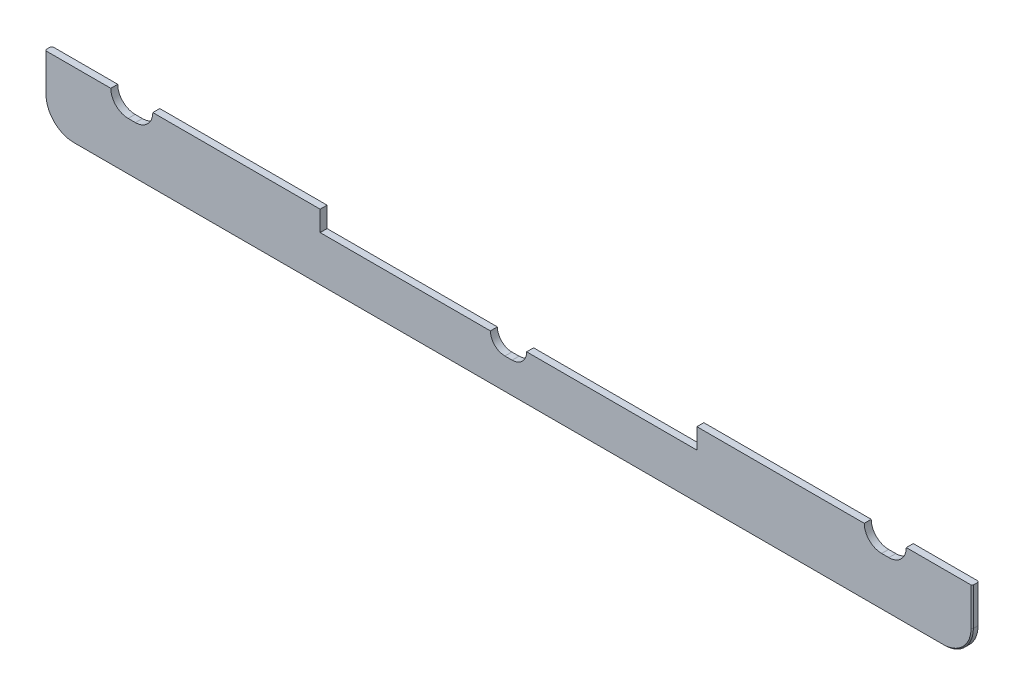
ISO-10303-21;
HEADER;
FILE_DESCRIPTION(('STEP AP214'),'2;1');
FILE_NAME('part.step','',(''),(''),'','','');
FILE_SCHEMA(('AUTOMOTIVE_DESIGN { 1 0 10303 214 1 1 1 1 }'));
ENDSEC;
DATA;
#1=APPLICATION_CONTEXT('core data for automotive mechanical design processes');
#2=APPLICATION_PROTOCOL_DEFINITION('international standard','automotive_design',2000,#1);
#3=PRODUCT_CONTEXT('',#1,'mechanical');
#4=PRODUCT('Part','Part','',(#3));
#5=PRODUCT_RELATED_PRODUCT_CATEGORY('part','',(#4));
#6=PRODUCT_DEFINITION_FORMATION('','',#4);
#7=PRODUCT_DEFINITION_CONTEXT('part definition',#1,'design');
#8=PRODUCT_DEFINITION('design','',#6,#7);
#9=PRODUCT_DEFINITION_SHAPE('','',#8);
#10=(LENGTH_UNIT() NAMED_UNIT(*) SI_UNIT(.MILLI.,.METRE.));
#11=(NAMED_UNIT(*) PLANE_ANGLE_UNIT() SI_UNIT($,.RADIAN.));
#12=(NAMED_UNIT(*) SI_UNIT($,.STERADIAN.) SOLID_ANGLE_UNIT());
#13=UNCERTAINTY_MEASURE_WITH_UNIT(LENGTH_MEASURE(1.E-05),#10,'distance_accuracy_value','');
#14=(GEOMETRIC_REPRESENTATION_CONTEXT(3) GLOBAL_UNCERTAINTY_ASSIGNED_CONTEXT((#13)) GLOBAL_UNIT_ASSIGNED_CONTEXT((#10,
#11,#12)) REPRESENTATION_CONTEXT('',''));
#15=CARTESIAN_POINT('',(0.,0.,0.));
#16=DIRECTION('',(0.,0.,1.));
#17=DIRECTION('',(1.,0.,0.));
#18=AXIS2_PLACEMENT_3D('',#15,#16,#17);
#19=CARTESIAN_POINT('',(-160.,0.,-0.01));
#20=DIRECTION('',(0.,-1.,0.));
#21=DIRECTION('',(0.,0.,-1.));
#22=AXIS2_PLACEMENT_3D('',#19,#20,#21);
#23=PLANE('',#22);
#24=DIRECTION('',(-1.,0.,0.));
#25=VECTOR('',#24,1.);
#26=CARTESIAN_POINT('',(0.,0.,0.));
#27=LINE('',#26,#25);
#28=CARTESIAN_POINT('',(-65.,0.,0.));
#29=VERTEX_POINT('',#28);
#30=CARTESIAN_POINT('',(-122.75,0.,0.));
#31=VERTEX_POINT('',#30);
#32=EDGE_CURVE('E412',#29,#31,#27,.T.);
#33=ORIENTED_EDGE('',*,*,#32,.T.);
#34=DIRECTION('',(0.,0.,-1.));
#35=VECTOR('',#34,1.);
#36=CARTESIAN_POINT('',(-122.75,0.,2.4));
#37=LINE('',#36,#35);
#38=CARTESIAN_POINT('',(-122.75,0.,2.4));
#39=VERTEX_POINT('',#38);
#40=EDGE_CURVE('E437',#31,#39,#37,.F.);
#41=ORIENTED_EDGE('',*,*,#40,.T.);
#42=DIRECTION('',(-1.,0.,0.));
#43=VECTOR('',#42,1.);
#44=CARTESIAN_POINT('',(0.,0.,2.4));
#45=LINE('',#44,#43);
#46=CARTESIAN_POINT('',(-65.,0.,2.4));
#47=VERTEX_POINT('',#46);
#48=EDGE_CURVE('E426',#47,#39,#45,.T.);
#49=ORIENTED_EDGE('',*,*,#48,.F.);
#50=DIRECTION('',(0.,0.,1.));
#51=VECTOR('',#50,1.);
#52=CARTESIAN_POINT('',(-65.,0.,-0.01));
#53=LINE('',#52,#51);
#54=EDGE_CURVE('E388',#29,#47,#53,.T.);
#55=ORIENTED_EDGE('',*,*,#54,.F.);
#56=EDGE_LOOP('',(#33,#41,#49,#55));
#57=FACE_BOUND('',#56,.T.);
#58=ADVANCED_FACE('F41',(#57),#23,.F.);
#59=CARTESIAN_POINT('',(-65.,0.,-0.01));
#60=DIRECTION('',(-1.,0.,0.));
#61=DIRECTION('',(0.,0.,1.));
#62=AXIS2_PLACEMENT_3D('',#59,#60,#61);
#63=PLANE('',#62);
#64=DIRECTION('',(0.,1.,0.));
#65=VECTOR('',#64,1.);
#66=CARTESIAN_POINT('',(-65.,0.,0.));
#67=LINE('',#66,#65);
#68=CARTESIAN_POINT('',(-65.,-7.00000000000001,0.));
#69=VERTEX_POINT('',#68);
#70=EDGE_CURVE('E408',#69,#29,#67,.T.);
#71=ORIENTED_EDGE('',*,*,#70,.T.);
#72=ORIENTED_EDGE('',*,*,#54,.T.);
#73=DIRECTION('',(0.,1.,0.));
#74=VECTOR('',#73,1.);
#75=CARTESIAN_POINT('',(-65.,0.,2.4));
#76=LINE('',#75,#74);
#77=CARTESIAN_POINT('',(-65.,-7.00000000000001,2.4));
#78=VERTEX_POINT('',#77);
#79=EDGE_CURVE('E423',#78,#47,#76,.T.);
#80=ORIENTED_EDGE('',*,*,#79,.F.);
#81=DIRECTION('',(0.,0.,1.));
#82=VECTOR('',#81,1.);
#83=CARTESIAN_POINT('',(-65.,-7.00000000000001,-0.01));
#84=LINE('',#83,#82);
#85=EDGE_CURVE('E431',#69,#78,#84,.T.);
#86=ORIENTED_EDGE('',*,*,#85,.F.);
#87=EDGE_LOOP('',(#71,#72,#80,#86));
#88=FACE_BOUND('',#87,.T.);
#89=ADVANCED_FACE('F559',(#88),#63,.F.);
#90=CARTESIAN_POINT('',(-65.,-7.00000000000001,-0.01));
#91=DIRECTION('',(0.,-1.,0.));
#92=DIRECTION('',(1.,0.,0.));
#93=AXIS2_PLACEMENT_3D('',#90,#91,#92);
#94=PLANE('',#93);
#95=DIRECTION('',(-1.,0.,0.));
#96=VECTOR('',#95,1.);
#97=CARTESIAN_POINT('',(0.,-7.,0.));
#98=LINE('',#97,#96);
#99=CARTESIAN_POINT('',(-6.25,-7.,0.));
#100=VERTEX_POINT('',#99);
#101=EDGE_CURVE('E411',#100,#69,#98,.T.);
#102=ORIENTED_EDGE('',*,*,#101,.T.);
#103=ORIENTED_EDGE('',*,*,#85,.T.);
#104=DIRECTION('',(-1.,0.,0.));
#105=VECTOR('',#104,1.);
#106=CARTESIAN_POINT('',(0.,-7.,2.4));
#107=LINE('',#106,#105);
#108=CARTESIAN_POINT('',(-6.25,-7.,2.4));
#109=VERTEX_POINT('',#108);
#110=EDGE_CURVE('E421',#109,#78,#107,.T.);
#111=ORIENTED_EDGE('',*,*,#110,.F.);
#112=DIRECTION('',(0.,0.,-1.));
#113=VECTOR('',#112,1.);
#114=CARTESIAN_POINT('',(-6.25,-7.,2.4));
#115=LINE('',#114,#113);
#116=EDGE_CURVE('E235',#109,#100,#115,.T.);
#117=ORIENTED_EDGE('',*,*,#116,.T.);
#118=EDGE_LOOP('',(#102,#103,#111,#117));
#119=FACE_BOUND('',#118,.T.);
#120=ADVANCED_FACE('F569',(#119),#94,.F.);
#121=CARTESIAN_POINT('',(65.,-6.99999999999999,-0.01));
#122=DIRECTION('',(1.,0.,0.));
#123=DIRECTION('',(0.,0.,-1.));
#124=AXIS2_PLACEMENT_3D('',#121,#122,#123);
#125=PLANE('',#124);
#126=DIRECTION('',(0.,-1.,0.));
#127=VECTOR('',#126,1.);
#128=CARTESIAN_POINT('',(65.,0.,0.));
#129=LINE('',#128,#127);
#130=CARTESIAN_POINT('',(65.,0.,0.));
#131=VERTEX_POINT('',#130);
#132=CARTESIAN_POINT('',(65.,-6.99999999999999,0.));
#133=VERTEX_POINT('',#132);
#134=EDGE_CURVE('E405',#131,#133,#129,.T.);
#135=ORIENTED_EDGE('',*,*,#134,.T.);
#136=DIRECTION('',(0.,0.,1.));
#137=VECTOR('',#136,1.);
#138=CARTESIAN_POINT('',(65.,-6.99999999999999,-0.01));
#139=LINE('',#138,#137);
#140=CARTESIAN_POINT('',(65.,-6.99999999999999,2.4));
#141=VERTEX_POINT('',#140);
#142=EDGE_CURVE('E50',#133,#141,#139,.T.);
#143=ORIENTED_EDGE('',*,*,#142,.T.);
#144=DIRECTION('',(0.,-1.,0.));
#145=VECTOR('',#144,1.);
#146=CARTESIAN_POINT('',(65.,0.,2.4));
#147=LINE('',#146,#145);
#148=CARTESIAN_POINT('',(65.,0.,2.4));
#149=VERTEX_POINT('',#148);
#150=EDGE_CURVE('E416',#149,#141,#147,.T.);
#151=ORIENTED_EDGE('',*,*,#150,.F.);
#152=DIRECTION('',(0.,0.,1.));
#153=VECTOR('',#152,1.);
#154=CARTESIAN_POINT('',(65.,0.,-0.01));
#155=LINE('',#154,#153);
#156=EDGE_CURVE('E11',#131,#149,#155,.T.);
#157=ORIENTED_EDGE('',*,*,#156,.F.);
#158=EDGE_LOOP('',(#135,#143,#151,#157));
#159=FACE_BOUND('',#158,.T.);
#160=ADVANCED_FACE('F568',(#159),#125,.F.);
#161=CARTESIAN_POINT('',(65.,0.,-0.01));
#162=DIRECTION('',(0.,-1.,0.));
#163=DIRECTION('',(1.,0.,0.));
#164=AXIS2_PLACEMENT_3D('',#161,#162,#163);
#165=PLANE('',#164);
#166=DIRECTION('',(-1.,0.,0.));
#167=VECTOR('',#166,1.);
#168=CARTESIAN_POINT('',(0.,0.,0.));
#169=LINE('',#168,#167);
#170=CARTESIAN_POINT('',(122.75,0.,0.));
#171=VERTEX_POINT('',#170);
#172=EDGE_CURVE('E45',#171,#131,#169,.T.);
#173=ORIENTED_EDGE('',*,*,#172,.T.);
#174=ORIENTED_EDGE('',*,*,#156,.T.);
#175=DIRECTION('',(-1.,0.,0.));
#176=VECTOR('',#175,1.);
#177=CARTESIAN_POINT('',(0.,0.,2.4));
#178=LINE('',#177,#176);
#179=CARTESIAN_POINT('',(122.75,0.,2.4));
#180=VERTEX_POINT('',#179);
#181=EDGE_CURVE('E418',#180,#149,#178,.T.);
#182=ORIENTED_EDGE('',*,*,#181,.F.);
#183=DIRECTION('',(0.,0.,-1.));
#184=VECTOR('',#183,1.);
#185=CARTESIAN_POINT('',(122.75,0.,2.4));
#186=LINE('',#185,#184);
#187=EDGE_CURVE('E398',#180,#171,#186,.T.);
#188=ORIENTED_EDGE('',*,*,#187,.T.);
#189=EDGE_LOOP('',(#173,#174,#182,#188));
#190=FACE_BOUND('',#189,.T.);
#191=ADVANCED_FACE('F459',(#190),#165,.F.);
#192=DIRECTION('',(-1.,0.,0.));
#193=VECTOR('',#192,1.);
#194=CARTESIAN_POINT('',(0.,-7.,0.));
#195=LINE('',#194,#193);
#196=CARTESIAN_POINT('',(6.25,-7.,0.));
#197=VERTEX_POINT('',#196);
#198=EDGE_CURVE('E407',#133,#197,#195,.T.);
#199=ORIENTED_EDGE('',*,*,#198,.T.);
#200=DIRECTION('',(0.,0.,-1.));
#201=VECTOR('',#200,1.);
#202=CARTESIAN_POINT('',(6.25,-7.,2.4));
#203=LINE('',#202,#201);
#204=CARTESIAN_POINT('',(6.25,-7.,2.4));
#205=VERTEX_POINT('',#204);
#206=EDGE_CURVE('E393',#197,#205,#203,.F.);
#207=ORIENTED_EDGE('',*,*,#206,.T.);
#208=DIRECTION('',(-1.,0.,0.));
#209=VECTOR('',#208,1.);
#210=CARTESIAN_POINT('',(0.,-7.,2.4));
#211=LINE('',#210,#209);
#212=EDGE_CURVE('E414',#141,#205,#211,.T.);
#213=ORIENTED_EDGE('',*,*,#212,.F.);
#214=ORIENTED_EDGE('',*,*,#142,.F.);
#215=EDGE_LOOP('',(#199,#207,#213,#214));
#216=FACE_BOUND('',#215,.T.);
#217=ADVANCED_FACE('F566',(#216),#94,.F.);
#218=DIRECTION('',(-0.707106781186583,0.,-0.707106781186512));
#219=VECTOR('',#218,1.);
#220=CARTESIAN_POINT('',(-159.6,0.,2.4));
#221=LINE('',#220,#219);
#222=CARTESIAN_POINT('',(-160.,0.,2.00000000000007));
#223=VERTEX_POINT('',#222);
#224=CARTESIAN_POINT('',(-159.6,0.,2.4));
#225=VERTEX_POINT('',#224);
#226=EDGE_CURVE('E396',#223,#225,#221,.F.);
#227=ORIENTED_EDGE('',*,*,#226,.T.);
#228=CARTESIAN_POINT('',(-137.25,0.,2.4));
#229=VERTEX_POINT('',#228);
#230=EDGE_CURVE('E427',#229,#225,#45,.T.);
#231=ORIENTED_EDGE('',*,*,#230,.F.);
#232=DIRECTION('',(0.,0.,-1.));
#233=VECTOR('',#232,1.);
#234=CARTESIAN_POINT('',(-137.25,0.,2.4));
#235=LINE('',#234,#233);
#236=CARTESIAN_POINT('',(-137.25,0.,0.));
#237=VERTEX_POINT('',#236);
#238=EDGE_CURVE('E440',#229,#237,#235,.T.);
#239=ORIENTED_EDGE('',*,*,#238,.T.);
#240=CARTESIAN_POINT('',(-159.6,0.,0.));
#241=VERTEX_POINT('',#240);
#242=EDGE_CURVE('E445',#237,#241,#27,.T.);
#243=ORIENTED_EDGE('',*,*,#242,.T.);
#244=DIRECTION('',(-0.707106781186534,0.,0.707106781186561));
#245=VECTOR('',#244,1.);
#246=CARTESIAN_POINT('',(-160.,0.,0.400000000000033));
#247=LINE('',#246,#245);
#248=CARTESIAN_POINT('',(-160.,0.,0.400000000000039));
#249=VERTEX_POINT('',#248);
#250=EDGE_CURVE('E389',#241,#249,#247,.T.);
#251=ORIENTED_EDGE('',*,*,#250,.T.);
#252=DIRECTION('',(0.,0.,-1.));
#253=VECTOR('',#252,1.);
#254=CARTESIAN_POINT('',(-160.,0.,2.4));
#255=LINE('',#254,#253);
#256=EDGE_CURVE('E402',#223,#249,#255,.T.);
#257=ORIENTED_EDGE('',*,*,#256,.F.);
#258=EDGE_LOOP('',(#227,#231,#239,#243,#251,#257));
#259=FACE_BOUND('',#258,.T.);
#260=ADVANCED_FACE('F43',(#259),#23,.F.);
#261=DIRECTION('',(-0.707106781186561,0.,0.707106781186534));
#262=VECTOR('',#261,1.);
#263=CARTESIAN_POINT('',(159.6,0.,2.4));
#264=LINE('',#263,#262);
#265=CARTESIAN_POINT('',(159.6,0.,2.4));
#266=VERTEX_POINT('',#265);
#267=CARTESIAN_POINT('',(160.,0.,2.00000000000007));
#268=VERTEX_POINT('',#267);
#269=EDGE_CURVE('E392',#266,#268,#264,.F.);
#270=ORIENTED_EDGE('',*,*,#269,.T.);
#271=DIRECTION('',(0.,0.,1.));
#272=VECTOR('',#271,1.);
#273=CARTESIAN_POINT('',(160.,0.,2.4));
#274=LINE('',#273,#272);
#275=CARTESIAN_POINT('',(160.,0.,0.400000000000039));
#276=VERTEX_POINT('',#275);
#277=EDGE_CURVE('E363',#276,#268,#274,.T.);
#278=ORIENTED_EDGE('',*,*,#277,.F.);
#279=DIRECTION('',(-0.707106781186512,0.,-0.707106781186583));
#280=VECTOR('',#279,1.);
#281=CARTESIAN_POINT('',(160.,0.,0.400000000000043));
#282=LINE('',#281,#280);
#283=CARTESIAN_POINT('',(159.6,0.,0.));
#284=VERTEX_POINT('',#283);
#285=EDGE_CURVE('E65',#276,#284,#282,.T.);
#286=ORIENTED_EDGE('',*,*,#285,.T.);
#287=DIRECTION('',(-1.,0.,0.));
#288=VECTOR('',#287,1.);
#289=CARTESIAN_POINT('',(0.,0.,0.));
#290=LINE('',#289,#288);
#291=CARTESIAN_POINT('',(137.25,0.,0.));
#292=VERTEX_POINT('',#291);
#293=EDGE_CURVE('E58',#284,#292,#290,.T.);
#294=ORIENTED_EDGE('',*,*,#293,.T.);
#295=DIRECTION('',(0.,0.,-1.));
#296=VECTOR('',#295,1.);
#297=CARTESIAN_POINT('',(137.25,0.,2.4));
#298=LINE('',#297,#296);
#299=CARTESIAN_POINT('',(137.25,0.,2.4));
#300=VERTEX_POINT('',#299);
#301=EDGE_CURVE('E400',#292,#300,#298,.F.);
#302=ORIENTED_EDGE('',*,*,#301,.T.);
#303=DIRECTION('',(-1.,0.,0.));
#304=VECTOR('',#303,1.);
#305=CARTESIAN_POINT('',(0.,0.,2.4));
#306=LINE('',#305,#304);
#307=EDGE_CURVE('E404',#266,#300,#306,.T.);
#308=ORIENTED_EDGE('',*,*,#307,.F.);
#309=EDGE_LOOP('',(#270,#278,#286,#294,#302,#308));
#310=FACE_BOUND('',#309,.T.);
#311=ADVANCED_FACE('F478',(#310),#165,.F.);
#312=CARTESIAN_POINT('',(0.,0.,2.4));
#313=DIRECTION('',(0.,0.,-1.));
#314=DIRECTION('',(-1.,0.,0.));
#315=AXIS2_PLACEMENT_3D('',#312,#313,#314);
#316=PLANE('',#315);
#317=CARTESIAN_POINT('',(-131.25,0.,2.4));
#318=DIRECTION('',(0.,0.,1.));
#319=DIRECTION('',(1.,0.,0.));
#320=AXIS2_PLACEMENT_3D('',#317,#318,#319);
#321=CIRCLE('',#320,6.00000000000005);
#322=CARTESIAN_POINT('',(-131.25,-6.00000000000005,2.4));
#323=VERTEX_POINT('',#322);
#324=EDGE_CURVE('E290',#229,#323,#321,.T.);
#325=ORIENTED_EDGE('',*,*,#324,.F.);
#326=ORIENTED_EDGE('',*,*,#230,.T.);
#327=DIRECTION('',(0.,-1.,0.));
#328=VECTOR('',#327,1.);
#329=CARTESIAN_POINT('',(-159.6,0.,2.4));
#330=LINE('',#329,#328);
#331=CARTESIAN_POINT('',(-159.6,-13.,2.4));
#332=VERTEX_POINT('',#331);
#333=EDGE_CURVE('E319',#225,#332,#330,.T.);
#334=ORIENTED_EDGE('',*,*,#333,.T.);
#335=CARTESIAN_POINT('',(-150.,-13.,2.4));
#336=DIRECTION('',(0.,0.,-1.));
#337=DIRECTION('',(-1.,0.,0.));
#338=AXIS2_PLACEMENT_3D('',#335,#336,#337);
#339=CIRCLE('',#338,9.60000000000004);
#340=CARTESIAN_POINT('',(-150.,-22.6,2.4));
#341=VERTEX_POINT('',#340);
#342=EDGE_CURVE('E321',#332,#341,#339,.F.);
#343=ORIENTED_EDGE('',*,*,#342,.T.);
#344=DIRECTION('',(1.,0.,0.));
#345=VECTOR('',#344,1.);
#346=CARTESIAN_POINT('',(0.,-22.6000000000001,2.4));
#347=LINE('',#346,#345);
#348=CARTESIAN_POINT('',(150.,-22.6000000000001,2.4));
#349=VERTEX_POINT('',#348);
#350=EDGE_CURVE('E323',#341,#349,#347,.T.);
#351=ORIENTED_EDGE('',*,*,#350,.T.);
#352=CARTESIAN_POINT('',(150.,-13.,2.4));
#353=DIRECTION('',(0.,0.,-1.));
#354=DIRECTION('',(-1.,0.,0.));
#355=AXIS2_PLACEMENT_3D('',#352,#353,#354);
#356=CIRCLE('',#355,9.60000000000005);
#357=CARTESIAN_POINT('',(159.6,-13.,2.4));
#358=VERTEX_POINT('',#357);
#359=EDGE_CURVE('E325',#349,#358,#356,.F.);
#360=ORIENTED_EDGE('',*,*,#359,.T.);
#361=DIRECTION('',(0.,1.,0.));
#362=VECTOR('',#361,1.);
#363=CARTESIAN_POINT('',(159.6,0.,2.4));
#364=LINE('',#363,#362);
#365=EDGE_CURVE('E327',#358,#266,#364,.T.);
#366=ORIENTED_EDGE('',*,*,#365,.T.);
#367=ORIENTED_EDGE('',*,*,#307,.T.);
#368=CARTESIAN_POINT('',(131.25,0.,2.4));
#369=DIRECTION('',(0.,0.,1.));
#370=DIRECTION('',(1.,0.,0.));
#371=AXIS2_PLACEMENT_3D('',#368,#369,#370);
#372=CIRCLE('',#371,6.00000000000001);
#373=CARTESIAN_POINT('',(131.25,-5.99999999999999,2.4));
#374=VERTEX_POINT('',#373);
#375=EDGE_CURVE('E267',#374,#300,#372,.T.);
#376=ORIENTED_EDGE('',*,*,#375,.F.);
#377=DIRECTION('',(1.,0.,0.));
#378=VECTOR('',#377,1.);
#379=CARTESIAN_POINT('',(131.25,-5.99999999999999,2.4));
#380=LINE('',#379,#378);
#381=CARTESIAN_POINT('',(128.75,-5.99999999999999,2.4));
#382=VERTEX_POINT('',#381);
#383=EDGE_CURVE('E273',#382,#374,#380,.T.);
#384=ORIENTED_EDGE('',*,*,#383,.F.);
#385=CARTESIAN_POINT('',(128.75,0.,2.4));
#386=DIRECTION('',(0.,0.,1.));
#387=DIRECTION('',(1.,0.,0.));
#388=AXIS2_PLACEMENT_3D('',#385,#386,#387);
#389=CIRCLE('',#388,6.00000000000001);
#390=EDGE_CURVE('E270',#180,#382,#389,.T.);
#391=ORIENTED_EDGE('',*,*,#390,.F.);
#392=ORIENTED_EDGE('',*,*,#181,.T.);
#393=ORIENTED_EDGE('',*,*,#150,.T.);
#394=ORIENTED_EDGE('',*,*,#212,.T.);
#395=CARTESIAN_POINT('',(1.25,-7.,2.4));
#396=DIRECTION('',(0.,0.,1.));
#397=DIRECTION('',(1.,0.,0.));
#398=AXIS2_PLACEMENT_3D('',#395,#396,#397);
#399=CIRCLE('',#398,5.);
#400=CARTESIAN_POINT('',(1.25,-12.,2.4));
#401=VERTEX_POINT('',#400);
#402=EDGE_CURVE('E256',#401,#205,#399,.T.);
#403=ORIENTED_EDGE('',*,*,#402,.F.);
#404=DIRECTION('',(1.,0.,0.));
#405=VECTOR('',#404,1.);
#406=CARTESIAN_POINT('',(-1.25,-12.,2.4));
#407=LINE('',#406,#405);
#408=CARTESIAN_POINT('',(-1.25,-12.,2.4));
#409=VERTEX_POINT('',#408);
#410=EDGE_CURVE('E240',#409,#401,#407,.T.);
#411=ORIENTED_EDGE('',*,*,#410,.F.);
#412=CARTESIAN_POINT('',(-1.25,-7.,2.4));
#413=DIRECTION('',(0.,0.,1.));
#414=DIRECTION('',(1.,0.,0.));
#415=AXIS2_PLACEMENT_3D('',#412,#413,#414);
#416=CIRCLE('',#415,5.);
#417=EDGE_CURVE('E230',#109,#409,#416,.T.);
#418=ORIENTED_EDGE('',*,*,#417,.F.);
#419=ORIENTED_EDGE('',*,*,#110,.T.);
#420=ORIENTED_EDGE('',*,*,#79,.T.);
#421=ORIENTED_EDGE('',*,*,#48,.T.);
#422=CARTESIAN_POINT('',(-128.75,0.,2.4));
#423=DIRECTION('',(0.,0.,1.));
#424=DIRECTION('',(1.,0.,0.));
#425=AXIS2_PLACEMENT_3D('',#422,#423,#424);
#426=CIRCLE('',#425,6.00000000000005);
#427=CARTESIAN_POINT('',(-128.75,-6.00000000000005,2.4));
#428=VERTEX_POINT('',#427);
#429=EDGE_CURVE('E287',#428,#39,#426,.T.);
#430=ORIENTED_EDGE('',*,*,#429,.F.);
#431=DIRECTION('',(1.,0.,0.));
#432=VECTOR('',#431,1.);
#433=CARTESIAN_POINT('',(-128.75,-6.00000000000005,2.4));
#434=LINE('',#433,#432);
#435=EDGE_CURVE('E293',#323,#428,#434,.T.);
#436=ORIENTED_EDGE('',*,*,#435,.F.);
#437=EDGE_LOOP('',(#325,#326,#334,#343,#351,#360,#366,#367,#376,#384,#391,#392,#393,#394,#403,
#411,#418,#419,#420,#421,#430,#436));
#438=FACE_BOUND('',#437,.T.);
#439=ADVANCED_FACE('F254',(#438),#316,.F.);
#440=CARTESIAN_POINT('',(0.,0.,0.));
#441=DIRECTION('',(0.,0.,-1.));
#442=DIRECTION('',(-1.,0.,0.));
#443=AXIS2_PLACEMENT_3D('',#440,#441,#442);
#444=PLANE('',#443);
#445=ORIENTED_EDGE('',*,*,#242,.F.);
#446=CARTESIAN_POINT('',(-131.25,0.,0.));
#447=DIRECTION('',(0.,0.,1.));
#448=DIRECTION('',(1.,0.,0.));
#449=AXIS2_PLACEMENT_3D('',#446,#447,#448);
#450=CIRCLE('',#449,6.00000000000005);
#451=CARTESIAN_POINT('',(-131.25,-6.00000000000005,0.));
#452=VERTEX_POINT('',#451);
#453=EDGE_CURVE('E298',#237,#452,#450,.T.);
#454=ORIENTED_EDGE('',*,*,#453,.T.);
#455=DIRECTION('',(1.,0.,0.));
#456=VECTOR('',#455,1.);
#457=CARTESIAN_POINT('',(-128.75,-6.00000000000005,0.));
#458=LINE('',#457,#456);
#459=CARTESIAN_POINT('',(-128.75,-6.00000000000005,0.));
#460=VERTEX_POINT('',#459);
#461=EDGE_CURVE('E291',#452,#460,#458,.T.);
#462=ORIENTED_EDGE('',*,*,#461,.T.);
#463=CARTESIAN_POINT('',(-128.75,0.,0.));
#464=DIRECTION('',(0.,0.,1.));
#465=DIRECTION('',(1.,0.,0.));
#466=AXIS2_PLACEMENT_3D('',#463,#464,#465);
#467=CIRCLE('',#466,6.00000000000005);
#468=EDGE_CURVE('E286',#460,#31,#467,.T.);
#469=ORIENTED_EDGE('',*,*,#468,.T.);
#470=ORIENTED_EDGE('',*,*,#32,.F.);
#471=ORIENTED_EDGE('',*,*,#70,.F.);
#472=ORIENTED_EDGE('',*,*,#101,.F.);
#473=CARTESIAN_POINT('',(-1.25,-7.,0.));
#474=DIRECTION('',(0.,0.,1.));
#475=DIRECTION('',(1.,0.,0.));
#476=AXIS2_PLACEMENT_3D('',#473,#474,#475);
#477=CIRCLE('',#476,5.);
#478=CARTESIAN_POINT('',(-1.25,-12.,0.));
#479=VERTEX_POINT('',#478);
#480=EDGE_CURVE('E260',#100,#479,#477,.T.);
#481=ORIENTED_EDGE('',*,*,#480,.T.);
#482=DIRECTION('',(1.,0.,0.));
#483=VECTOR('',#482,1.);
#484=CARTESIAN_POINT('',(-1.25,-12.,0.));
#485=LINE('',#484,#483);
#486=CARTESIAN_POINT('',(1.25,-12.,0.));
#487=VERTEX_POINT('',#486);
#488=EDGE_CURVE('E248',#479,#487,#485,.T.);
#489=ORIENTED_EDGE('',*,*,#488,.T.);
#490=CARTESIAN_POINT('',(1.25,-7.,0.));
#491=DIRECTION('',(0.,0.,1.));
#492=DIRECTION('',(1.,0.,0.));
#493=AXIS2_PLACEMENT_3D('',#490,#491,#492);
#494=CIRCLE('',#493,5.);
#495=EDGE_CURVE('E241',#487,#197,#494,.T.);
#496=ORIENTED_EDGE('',*,*,#495,.T.);
#497=ORIENTED_EDGE('',*,*,#198,.F.);
#498=ORIENTED_EDGE('',*,*,#134,.F.);
#499=ORIENTED_EDGE('',*,*,#172,.F.);
#500=CARTESIAN_POINT('',(128.75,0.,0.));
#501=DIRECTION('',(0.,0.,1.));
#502=DIRECTION('',(1.,0.,0.));
#503=AXIS2_PLACEMENT_3D('',#500,#501,#502);
#504=CIRCLE('',#503,6.00000000000001);
#505=CARTESIAN_POINT('',(128.75,-5.99999999999999,0.));
#506=VERTEX_POINT('',#505);
#507=EDGE_CURVE('E277',#171,#506,#504,.T.);
#508=ORIENTED_EDGE('',*,*,#507,.T.);
#509=DIRECTION('',(1.,0.,0.));
#510=VECTOR('',#509,1.);
#511=CARTESIAN_POINT('',(131.25,-5.99999999999999,0.));
#512=LINE('',#511,#510);
#513=CARTESIAN_POINT('',(131.25,-5.99999999999999,0.));
#514=VERTEX_POINT('',#513);
#515=EDGE_CURVE('E271',#506,#514,#512,.T.);
#516=ORIENTED_EDGE('',*,*,#515,.T.);
#517=CARTESIAN_POINT('',(131.25,0.,0.));
#518=DIRECTION('',(0.,0.,1.));
#519=DIRECTION('',(1.,0.,0.));
#520=AXIS2_PLACEMENT_3D('',#517,#518,#519);
#521=CIRCLE('',#520,6.00000000000001);
#522=EDGE_CURVE('E249',#514,#292,#521,.T.);
#523=ORIENTED_EDGE('',*,*,#522,.T.);
#524=ORIENTED_EDGE('',*,*,#293,.F.);
#525=DIRECTION('',(0.,-1.,0.));
#526=VECTOR('',#525,1.);
#527=CARTESIAN_POINT('',(159.6,-13.,0.));
#528=LINE('',#527,#526);
#529=CARTESIAN_POINT('',(159.6,-13.,0.));
#530=VERTEX_POINT('',#529);
#531=EDGE_CURVE('E361',#284,#530,#528,.T.);
#532=ORIENTED_EDGE('',*,*,#531,.T.);
#533=CARTESIAN_POINT('',(150.,-13.,0.));
#534=DIRECTION('',(0.,0.,-1.));
#535=DIRECTION('',(-1.,0.,0.));
#536=AXIS2_PLACEMENT_3D('',#533,#534,#535);
#537=CIRCLE('',#536,9.6);
#538=CARTESIAN_POINT('',(150.,-22.6,0.));
#539=VERTEX_POINT('',#538);
#540=EDGE_CURVE('E359',#530,#539,#537,.T.);
#541=ORIENTED_EDGE('',*,*,#540,.T.);
#542=DIRECTION('',(-1.,0.,0.));
#543=VECTOR('',#542,1.);
#544=CARTESIAN_POINT('',(-150.,-22.6,0.));
#545=LINE('',#544,#543);
#546=CARTESIAN_POINT('',(-150.,-22.6,0.));
#547=VERTEX_POINT('',#546);
#548=EDGE_CURVE('E357',#539,#547,#545,.T.);
#549=ORIENTED_EDGE('',*,*,#548,.T.);
#550=CARTESIAN_POINT('',(-150.,-13.,0.));
#551=DIRECTION('',(0.,0.,-1.));
#552=DIRECTION('',(-1.,0.,0.));
#553=AXIS2_PLACEMENT_3D('',#550,#551,#552);
#554=CIRCLE('',#553,9.6);
#555=CARTESIAN_POINT('',(-159.6,-13.,0.));
#556=VERTEX_POINT('',#555);
#557=EDGE_CURVE('E355',#547,#556,#554,.T.);
#558=ORIENTED_EDGE('',*,*,#557,.T.);
#559=DIRECTION('',(0.,1.,0.));
#560=VECTOR('',#559,1.);
#561=CARTESIAN_POINT('',(-159.6,17.,0.));
#562=LINE('',#561,#560);
#563=EDGE_CURVE('E352',#556,#241,#562,.T.);
#564=ORIENTED_EDGE('',*,*,#563,.T.);
#565=EDGE_LOOP('',(#445,#454,#462,#469,#470,#471,#472,#481,#489,#496,#497,#498,#499,#508,#516,
#523,#524,#532,#541,#549,#558,#564));
#566=FACE_BOUND('',#565,.T.);
#567=ADVANCED_FACE('F463',(#566),#444,.T.);
#568=CARTESIAN_POINT('',(-160.,-23.,2.4));
#569=DIRECTION('',(1.,0.,0.));
#570=DIRECTION('',(0.,1.,0.));
#571=AXIS2_PLACEMENT_3D('',#568,#569,#570);
#572=PLANE('',#571);
#573=DIRECTION('',(0.,1.,0.));
#574=VECTOR('',#573,1.);
#575=CARTESIAN_POINT('',(-160.,-23.,2.00000000000007));
#576=LINE('',#575,#574);
#577=CARTESIAN_POINT('',(-160.,-13.,2.00000000000007));
#578=VERTEX_POINT('',#577);
#579=EDGE_CURVE('E349',#578,#223,#576,.T.);
#580=ORIENTED_EDGE('',*,*,#579,.T.);
#581=ORIENTED_EDGE('',*,*,#256,.T.);
#582=DIRECTION('',(0.,-1.,0.));
#583=VECTOR('',#582,1.);
#584=CARTESIAN_POINT('',(-160.,-13.,0.400000000000039));
#585=LINE('',#584,#583);
#586=CARTESIAN_POINT('',(-160.,-13.,0.400000000000039));
#587=VERTEX_POINT('',#586);
#588=EDGE_CURVE('E347',#249,#587,#585,.T.);
#589=ORIENTED_EDGE('',*,*,#588,.T.);
#590=DIRECTION('',(0.,0.,-1.));
#591=VECTOR('',#590,1.);
#592=CARTESIAN_POINT('',(-160.,-13.,2.4));
#593=LINE('',#592,#591);
#594=EDGE_CURVE('E310',#587,#578,#593,.F.);
#595=ORIENTED_EDGE('',*,*,#594,.T.);
#596=EDGE_LOOP('',(#580,#581,#589,#595));
#597=FACE_BOUND('',#596,.T.);
#598=ADVANCED_FACE('F528',(#597),#572,.F.);
#599=CARTESIAN_POINT('',(160.,-23.,2.4));
#600=DIRECTION('',(0.,1.,0.));
#601=DIRECTION('',(-1.,0.,0.));
#602=AXIS2_PLACEMENT_3D('',#599,#600,#601);
#603=PLANE('',#602);
#604=DIRECTION('',(0.,0.,-1.));
#605=VECTOR('',#604,1.);
#606=CARTESIAN_POINT('',(150.,-23.,2.4));
#607=LINE('',#606,#605);
#608=CARTESIAN_POINT('',(150.,-23.,0.400000000000039));
#609=VERTEX_POINT('',#608);
#610=CARTESIAN_POINT('',(150.,-23.,2.00000000000007));
#611=VERTEX_POINT('',#610);
#612=EDGE_CURVE('E313',#609,#611,#607,.F.);
#613=ORIENTED_EDGE('',*,*,#612,.T.);
#614=DIRECTION('',(-1.,0.,0.));
#615=VECTOR('',#614,1.);
#616=CARTESIAN_POINT('',(160.,-23.,2.00000000000007));
#617=LINE('',#616,#615);
#618=CARTESIAN_POINT('',(-150.,-23.,2.00000000000007));
#619=VERTEX_POINT('',#618);
#620=EDGE_CURVE('E341',#611,#619,#617,.T.);
#621=ORIENTED_EDGE('',*,*,#620,.T.);
#622=DIRECTION('',(0.,0.,-1.));
#623=VECTOR('',#622,1.);
#624=CARTESIAN_POINT('',(-150.,-23.,2.4));
#625=LINE('',#624,#623);
#626=CARTESIAN_POINT('',(-150.,-23.,0.400000000000039));
#627=VERTEX_POINT('',#626);
#628=EDGE_CURVE('E316',#619,#627,#625,.T.);
#629=ORIENTED_EDGE('',*,*,#628,.T.);
#630=DIRECTION('',(1.,0.,0.));
#631=VECTOR('',#630,1.);
#632=CARTESIAN_POINT('',(150.,-23.,0.400000000000039));
#633=LINE('',#632,#631);
#634=EDGE_CURVE('E339',#627,#609,#633,.T.);
#635=ORIENTED_EDGE('',*,*,#634,.T.);
#636=EDGE_LOOP('',(#613,#621,#629,#635));
#637=FACE_BOUND('',#636,.T.);
#638=ADVANCED_FACE('F511',(#637),#603,.F.);
#639=CARTESIAN_POINT('',(160.,-23.,2.4));
#640=DIRECTION('',(-1.,0.,0.));
#641=DIRECTION('',(0.,-1.,0.));
#642=AXIS2_PLACEMENT_3D('',#639,#640,#641);
#643=PLANE('',#642);
#644=DIRECTION('',(0.,1.,0.));
#645=VECTOR('',#644,1.);
#646=CARTESIAN_POINT('',(160.,17.,0.400000000000039));
#647=LINE('',#646,#645);
#648=CARTESIAN_POINT('',(160.,-13.,0.400000000000039));
#649=VERTEX_POINT('',#648);
#650=EDGE_CURVE('E330',#649,#276,#647,.T.);
#651=ORIENTED_EDGE('',*,*,#650,.T.);
#652=ORIENTED_EDGE('',*,*,#277,.T.);
#653=DIRECTION('',(0.,-1.,0.));
#654=VECTOR('',#653,1.);
#655=CARTESIAN_POINT('',(160.,-23.,2.00000000000007));
#656=LINE('',#655,#654);
#657=CARTESIAN_POINT('',(160.,-13.,2.00000000000007));
#658=VERTEX_POINT('',#657);
#659=EDGE_CURVE('E333',#268,#658,#656,.T.);
#660=ORIENTED_EDGE('',*,*,#659,.T.);
#661=DIRECTION('',(0.,0.,-1.));
#662=VECTOR('',#661,1.);
#663=CARTESIAN_POINT('',(160.,-13.,2.4));
#664=LINE('',#663,#662);
#665=EDGE_CURVE('E307',#658,#649,#664,.T.);
#666=ORIENTED_EDGE('',*,*,#665,.T.);
#667=EDGE_LOOP('',(#651,#652,#660,#666));
#668=FACE_BOUND('',#667,.T.);
#669=ADVANCED_FACE('F497',(#668),#643,.F.);
#670=CARTESIAN_POINT('',(-128.75,0.,2.4));
#671=DIRECTION('',(0.,0.,-1.));
#672=DIRECTION('',(-1.,0.,0.));
#673=AXIS2_PLACEMENT_3D('',#670,#671,#672);
#674=CYLINDRICAL_SURFACE('',#673,6.00000000000005);
#675=ORIENTED_EDGE('',*,*,#40,.F.);
#676=ORIENTED_EDGE('',*,*,#468,.F.);
#677=DIRECTION('',(0.,0.,-1.));
#678=VECTOR('',#677,1.);
#679=CARTESIAN_POINT('',(-128.75,-6.00000000000005,2.4));
#680=LINE('',#679,#678);
#681=EDGE_CURVE('E295',#428,#460,#680,.T.);
#682=ORIENTED_EDGE('',*,*,#681,.F.);
#683=ORIENTED_EDGE('',*,*,#429,.T.);
#684=EDGE_LOOP('',(#675,#676,#682,#683));
#685=FACE_BOUND('',#684,.T.);
#686=ADVANCED_FACE('F554',(#685),#674,.F.);
#687=CARTESIAN_POINT('',(-131.25,0.,2.4));
#688=DIRECTION('',(0.,0.,-1.));
#689=DIRECTION('',(-1.,0.,0.));
#690=AXIS2_PLACEMENT_3D('',#687,#688,#689);
#691=CYLINDRICAL_SURFACE('',#690,6.00000000000005);
#692=ORIENTED_EDGE('',*,*,#238,.F.);
#693=ORIENTED_EDGE('',*,*,#324,.T.);
#694=DIRECTION('',(0.,0.,-1.));
#695=VECTOR('',#694,1.);
#696=CARTESIAN_POINT('',(-131.25,-6.00000000000005,2.4));
#697=LINE('',#696,#695);
#698=EDGE_CURVE('E304',#323,#452,#697,.T.);
#699=ORIENTED_EDGE('',*,*,#698,.T.);
#700=ORIENTED_EDGE('',*,*,#453,.F.);
#701=EDGE_LOOP('',(#692,#693,#699,#700));
#702=FACE_BOUND('',#701,.T.);
#703=ADVANCED_FACE('F545',(#702),#691,.F.);
#704=CARTESIAN_POINT('',(-128.75,-6.00000000000005,2.4));
#705=DIRECTION('',(0.,1.,0.));
#706=DIRECTION('',(0.,0.,1.));
#707=AXIS2_PLACEMENT_3D('',#704,#705,#706);
#708=PLANE('',#707);
#709=ORIENTED_EDGE('',*,*,#461,.F.);
#710=ORIENTED_EDGE('',*,*,#698,.F.);
#711=ORIENTED_EDGE('',*,*,#435,.T.);
#712=ORIENTED_EDGE('',*,*,#681,.T.);
#713=EDGE_LOOP('',(#709,#710,#711,#712));
#714=FACE_BOUND('',#713,.T.);
#715=ADVANCED_FACE('F550',(#714),#708,.T.);
#716=CARTESIAN_POINT('',(131.25,0.,2.4));
#717=DIRECTION('',(0.,0.,-1.));
#718=DIRECTION('',(-1.,0.,0.));
#719=AXIS2_PLACEMENT_3D('',#716,#717,#718);
#720=CYLINDRICAL_SURFACE('',#719,6.00000000000001);
#721=ORIENTED_EDGE('',*,*,#301,.F.);
#722=ORIENTED_EDGE('',*,*,#522,.F.);
#723=DIRECTION('',(0.,0.,-1.));
#724=VECTOR('',#723,1.);
#725=CARTESIAN_POINT('',(131.25,-5.99999999999999,2.4));
#726=LINE('',#725,#724);
#727=EDGE_CURVE('E275',#374,#514,#726,.T.);
#728=ORIENTED_EDGE('',*,*,#727,.F.);
#729=ORIENTED_EDGE('',*,*,#375,.T.);
#730=EDGE_LOOP('',(#721,#722,#728,#729));
#731=FACE_BOUND('',#730,.T.);
#732=ADVANCED_FACE('F475',(#731),#720,.F.);
#733=CARTESIAN_POINT('',(128.75,0.,2.4));
#734=DIRECTION('',(0.,0.,-1.));
#735=DIRECTION('',(-1.,0.,0.));
#736=AXIS2_PLACEMENT_3D('',#733,#734,#735);
#737=CYLINDRICAL_SURFACE('',#736,6.00000000000001);
#738=ORIENTED_EDGE('',*,*,#187,.F.);
#739=ORIENTED_EDGE('',*,*,#390,.T.);
#740=DIRECTION('',(0.,0.,-1.));
#741=VECTOR('',#740,1.);
#742=CARTESIAN_POINT('',(128.75,-5.99999999999999,2.4));
#743=LINE('',#742,#741);
#744=EDGE_CURVE('E283',#382,#506,#743,.T.);
#745=ORIENTED_EDGE('',*,*,#744,.T.);
#746=ORIENTED_EDGE('',*,*,#507,.F.);
#747=EDGE_LOOP('',(#738,#739,#745,#746));
#748=FACE_BOUND('',#747,.T.);
#749=ADVANCED_FACE('F466',(#748),#737,.F.);
#750=CARTESIAN_POINT('',(131.25,-5.99999999999999,2.4));
#751=DIRECTION('',(0.,1.,0.));
#752=DIRECTION('',(0.,0.,1.));
#753=AXIS2_PLACEMENT_3D('',#750,#751,#752);
#754=PLANE('',#753);
#755=ORIENTED_EDGE('',*,*,#515,.F.);
#756=ORIENTED_EDGE('',*,*,#744,.F.);
#757=ORIENTED_EDGE('',*,*,#383,.T.);
#758=ORIENTED_EDGE('',*,*,#727,.T.);
#759=EDGE_LOOP('',(#755,#756,#757,#758));
#760=FACE_BOUND('',#759,.T.);
#761=ADVANCED_FACE('F472',(#760),#754,.T.);
#762=CARTESIAN_POINT('',(-1.25,-7.,2.4));
#763=DIRECTION('',(0.,0.,-1.));
#764=DIRECTION('',(-1.,0.,0.));
#765=AXIS2_PLACEMENT_3D('',#762,#763,#764);
#766=CYLINDRICAL_SURFACE('',#765,5.);
#767=ORIENTED_EDGE('',*,*,#116,.F.);
#768=ORIENTED_EDGE('',*,*,#417,.T.);
#769=DIRECTION('',(0.,0.,-1.));
#770=VECTOR('',#769,1.);
#771=CARTESIAN_POINT('',(-1.25,-12.,2.4));
#772=LINE('',#771,#770);
#773=EDGE_CURVE('E234',#409,#479,#772,.T.);
#774=ORIENTED_EDGE('',*,*,#773,.T.);
#775=ORIENTED_EDGE('',*,*,#480,.F.);
#776=EDGE_LOOP('',(#767,#768,#774,#775));
#777=FACE_BOUND('',#776,.T.);
#778=ADVANCED_FACE('F232',(#777),#766,.F.);
#779=CARTESIAN_POINT('',(-1.25,-12.,2.4));
#780=DIRECTION('',(0.,1.,0.));
#781=DIRECTION('',(0.,0.,1.));
#782=AXIS2_PLACEMENT_3D('',#779,#780,#781);
#783=PLANE('',#782);
#784=ORIENTED_EDGE('',*,*,#488,.F.);
#785=ORIENTED_EDGE('',*,*,#773,.F.);
#786=ORIENTED_EDGE('',*,*,#410,.T.);
#787=DIRECTION('',(0.,0.,-1.));
#788=VECTOR('',#787,1.);
#789=CARTESIAN_POINT('',(1.25,-12.,2.4));
#790=LINE('',#789,#788);
#791=EDGE_CURVE('E250',#401,#487,#790,.T.);
#792=ORIENTED_EDGE('',*,*,#791,.T.);
#793=EDGE_LOOP('',(#784,#785,#786,#792));
#794=FACE_BOUND('',#793,.T.);
#795=ADVANCED_FACE('F245',(#794),#783,.T.);
#796=CARTESIAN_POINT('',(1.25,-7.,2.4));
#797=DIRECTION('',(0.,0.,-1.));
#798=DIRECTION('',(-1.,0.,0.));
#799=AXIS2_PLACEMENT_3D('',#796,#797,#798);
#800=CYLINDRICAL_SURFACE('',#799,5.);
#801=ORIENTED_EDGE('',*,*,#206,.F.);
#802=ORIENTED_EDGE('',*,*,#495,.F.);
#803=ORIENTED_EDGE('',*,*,#791,.F.);
#804=ORIENTED_EDGE('',*,*,#402,.T.);
#805=EDGE_LOOP('',(#801,#802,#803,#804));
#806=FACE_BOUND('',#805,.T.);
#807=ADVANCED_FACE('F562',(#806),#800,.F.);
#808=CARTESIAN_POINT('',(-150.,-13.,2.4));
#809=DIRECTION('',(0.,0.,-1.));
#810=DIRECTION('',(-1.,0.,0.));
#811=AXIS2_PLACEMENT_3D('',#808,#809,#810);
#812=CYLINDRICAL_SURFACE('',#811,10.);
#813=ORIENTED_EDGE('',*,*,#628,.F.);
#814=CARTESIAN_POINT('',(-150.,-13.,2.00000000000007));
#815=DIRECTION('',(0.,0.,-1.));
#816=DIRECTION('',(-1.,0.,0.));
#817=AXIS2_PLACEMENT_3D('',#814,#815,#816);
#818=CIRCLE('',#817,10.);
#819=EDGE_CURVE('E345',#619,#578,#818,.T.);
#820=ORIENTED_EDGE('',*,*,#819,.T.);
#821=ORIENTED_EDGE('',*,*,#594,.F.);
#822=CARTESIAN_POINT('',(-150.,-13.,0.400000000000039));
#823=DIRECTION('',(0.,0.,-1.));
#824=DIRECTION('',(-1.,0.,0.));
#825=AXIS2_PLACEMENT_3D('',#822,#823,#824);
#826=CIRCLE('',#825,10.);
#827=EDGE_CURVE('E343',#587,#627,#826,.F.);
#828=ORIENTED_EDGE('',*,*,#827,.T.);
#829=EDGE_LOOP('',(#813,#820,#821,#828));
#830=FACE_BOUND('',#829,.T.);
#831=ADVANCED_FACE('F524',(#830),#812,.T.);
#832=CARTESIAN_POINT('',(150.,-13.,2.4));
#833=DIRECTION('',(0.,0.,-1.));
#834=DIRECTION('',(-1.,0.,0.));
#835=AXIS2_PLACEMENT_3D('',#832,#833,#834);
#836=CYLINDRICAL_SURFACE('',#835,10.);
#837=ORIENTED_EDGE('',*,*,#665,.F.);
#838=CARTESIAN_POINT('',(150.,-13.,2.00000000000007));
#839=DIRECTION('',(0.,0.,-1.));
#840=DIRECTION('',(-1.,0.,0.));
#841=AXIS2_PLACEMENT_3D('',#838,#839,#840);
#842=CIRCLE('',#841,10.);
#843=EDGE_CURVE('E337',#658,#611,#842,.T.);
#844=ORIENTED_EDGE('',*,*,#843,.T.);
#845=ORIENTED_EDGE('',*,*,#612,.F.);
#846=CARTESIAN_POINT('',(150.,-13.,0.400000000000039));
#847=DIRECTION('',(0.,0.,-1.));
#848=DIRECTION('',(-1.,0.,0.));
#849=AXIS2_PLACEMENT_3D('',#846,#847,#848);
#850=CIRCLE('',#849,10.);
#851=EDGE_CURVE('E335',#609,#649,#850,.F.);
#852=ORIENTED_EDGE('',*,*,#851,.T.);
#853=EDGE_LOOP('',(#837,#844,#845,#852));
#854=FACE_BOUND('',#853,.T.);
#855=ADVANCED_FACE('F495',(#854),#836,.T.);
#856=CARTESIAN_POINT('',(-159.6,0.,2.4));
#857=DIRECTION('',(0.707106781186512,0.,-0.707106781186583));
#858=DIRECTION('',(0.,-1.,0.));
#859=AXIS2_PLACEMENT_3D('',#856,#857,#858);
#860=PLANE('',#859);
#861=ORIENTED_EDGE('',*,*,#226,.F.);
#862=ORIENTED_EDGE('',*,*,#579,.F.);
#863=DIRECTION('',(-0.707106781186572,0.,-0.707106781186523));
#864=VECTOR('',#863,1.);
#865=CARTESIAN_POINT('',(-159.6,-13.,2.4));
#866=LINE('',#865,#864);
#867=EDGE_CURVE('E262',#332,#578,#866,.T.);
#868=ORIENTED_EDGE('',*,*,#867,.F.);
#869=ORIENTED_EDGE('',*,*,#333,.F.);
#870=EDGE_LOOP('',(#861,#862,#868,#869));
#871=FACE_BOUND('',#870,.T.);
#872=ADVANCED_FACE('F532',(#871),#860,.F.);
#873=CARTESIAN_POINT('',(-150.,-13.,2.4));
#874=DIRECTION('',(0.,0.,-1.));
#875=DIRECTION('',(-1.,0.,0.));
#876=AXIS2_PLACEMENT_3D('',#873,#874,#875);
#877=CONICAL_SURFACE('',#876,9.60000000000004,0.785398163397483);
#878=ORIENTED_EDGE('',*,*,#867,.T.);
#879=ORIENTED_EDGE('',*,*,#819,.F.);
#880=DIRECTION('',(0.,-0.707106781186572,-0.707106781186523));
#881=VECTOR('',#880,1.);
#882=CARTESIAN_POINT('',(-150.,-22.6,2.4));
#883=LINE('',#882,#881);
#884=EDGE_CURVE('E371',#341,#619,#883,.T.);
#885=ORIENTED_EDGE('',*,*,#884,.F.);
#886=ORIENTED_EDGE('',*,*,#342,.F.);
#887=EDGE_LOOP('',(#878,#879,#885,#886));
#888=FACE_BOUND('',#887,.T.);
#889=ADVANCED_FACE('F520',(#888),#877,.T.);
#890=CARTESIAN_POINT('',(0.,-22.6000000000001,2.4));
#891=DIRECTION('',(0.,0.707106781186521,-0.707106781186574));
#892=DIRECTION('',(1.,0.,0.));
#893=AXIS2_PLACEMENT_3D('',#890,#891,#892);
#894=PLANE('',#893);
#895=ORIENTED_EDGE('',*,*,#884,.T.);
#896=ORIENTED_EDGE('',*,*,#620,.F.);
#897=DIRECTION('',(0.,-0.707106781186575,-0.70710678118652));
#898=VECTOR('',#897,1.);
#899=CARTESIAN_POINT('',(150.,-22.6000000000001,2.4));
#900=LINE('',#899,#898);
#901=EDGE_CURVE('E367',#349,#611,#900,.T.);
#902=ORIENTED_EDGE('',*,*,#901,.F.);
#903=ORIENTED_EDGE('',*,*,#350,.F.);
#904=EDGE_LOOP('',(#895,#896,#902,#903));
#905=FACE_BOUND('',#904,.T.);
#906=ADVANCED_FACE('F514',(#905),#894,.F.);
#907=CARTESIAN_POINT('',(150.,-13.,2.4));
#908=DIRECTION('',(0.,0.,-1.));
#909=DIRECTION('',(-1.,0.,0.));
#910=AXIS2_PLACEMENT_3D('',#907,#908,#909);
#911=CONICAL_SURFACE('',#910,9.60000000000005,0.785398163397472);
#912=ORIENTED_EDGE('',*,*,#901,.T.);
#913=ORIENTED_EDGE('',*,*,#843,.F.);
#914=DIRECTION('',(0.707106781186572,0.,-0.707106781186523));
#915=VECTOR('',#914,1.);
#916=CARTESIAN_POINT('',(159.6,-13.,2.4));
#917=LINE('',#916,#915);
#918=EDGE_CURVE('E364',#358,#658,#917,.T.);
#919=ORIENTED_EDGE('',*,*,#918,.F.);
#920=ORIENTED_EDGE('',*,*,#359,.F.);
#921=EDGE_LOOP('',(#912,#913,#919,#920));
#922=FACE_BOUND('',#921,.T.);
#923=ADVANCED_FACE('F507',(#922),#911,.T.);
#924=CARTESIAN_POINT('',(159.6,0.,2.4));
#925=DIRECTION('',(-0.707106781186534,0.,-0.707106781186561));
#926=DIRECTION('',(0.,1.,0.));
#927=AXIS2_PLACEMENT_3D('',#924,#925,#926);
#928=PLANE('',#927);
#929=ORIENTED_EDGE('',*,*,#269,.F.);
#930=ORIENTED_EDGE('',*,*,#365,.F.);
#931=ORIENTED_EDGE('',*,*,#918,.T.);
#932=ORIENTED_EDGE('',*,*,#659,.F.);
#933=EDGE_LOOP('',(#929,#930,#931,#932));
#934=FACE_BOUND('',#933,.T.);
#935=ADVANCED_FACE('F504',(#934),#928,.F.);
#936=CARTESIAN_POINT('',(-160.,-23.,0.400000000000039));
#937=DIRECTION('',(-0.707106781186561,0.,-0.707106781186534));
#938=DIRECTION('',(0.,1.,0.));
#939=AXIS2_PLACEMENT_3D('',#936,#937,#938);
#940=PLANE('',#939);
#941=ORIENTED_EDGE('',*,*,#250,.F.);
#942=ORIENTED_EDGE('',*,*,#563,.F.);
#943=DIRECTION('',(0.707106781186548,0.,-0.707106781186548));
#944=VECTOR('',#943,1.);
#945=CARTESIAN_POINT('',(-160.,-13.,0.400000000000039));
#946=LINE('',#945,#944);
#947=EDGE_CURVE('E368',#587,#556,#946,.T.);
#948=ORIENTED_EDGE('',*,*,#947,.F.);
#949=ORIENTED_EDGE('',*,*,#588,.F.);
#950=EDGE_LOOP('',(#941,#942,#948,#949));
#951=FACE_BOUND('',#950,.T.);
#952=ADVANCED_FACE('F539',(#951),#940,.T.);
#953=CARTESIAN_POINT('',(-150.,-13.,0.));
#954=DIRECTION('',(0.,0.,1.));
#955=DIRECTION('',(1.,0.,0.));
#956=AXIS2_PLACEMENT_3D('',#953,#954,#955);
#957=CONICAL_SURFACE('',#956,9.59999999999999,0.785398163397414);
#958=ORIENTED_EDGE('',*,*,#947,.T.);
#959=ORIENTED_EDGE('',*,*,#557,.F.);
#960=DIRECTION('',(0.,0.707106781186514,-0.707106781186581));
#961=VECTOR('',#960,1.);
#962=CARTESIAN_POINT('',(-150.,-23.,0.400000000000039));
#963=LINE('',#962,#961);
#964=EDGE_CURVE('E382',#627,#547,#963,.T.);
#965=ORIENTED_EDGE('',*,*,#964,.F.);
#966=ORIENTED_EDGE('',*,*,#827,.F.);
#967=EDGE_LOOP('',(#958,#959,#965,#966));
#968=FACE_BOUND('',#967,.T.);
#969=ADVANCED_FACE('F542',(#968),#957,.T.);
#970=CARTESIAN_POINT('',(160.,-23.,0.400000000000039));
#971=DIRECTION('',(0.,-0.70710678118657,-0.707106781186524));
#972=DIRECTION('',(-1.,0.,0.));
#973=AXIS2_PLACEMENT_3D('',#970,#971,#972);
#974=PLANE('',#973);
#975=ORIENTED_EDGE('',*,*,#964,.T.);
#976=ORIENTED_EDGE('',*,*,#548,.F.);
#977=DIRECTION('',(0.,0.707106781186523,-0.707106781186572));
#978=VECTOR('',#977,1.);
#979=CARTESIAN_POINT('',(150.,-23.,0.400000000000039));
#980=LINE('',#979,#978);
#981=EDGE_CURVE('E379',#609,#539,#980,.T.);
#982=ORIENTED_EDGE('',*,*,#981,.F.);
#983=ORIENTED_EDGE('',*,*,#634,.F.);
#984=EDGE_LOOP('',(#975,#976,#982,#983));
#985=FACE_BOUND('',#984,.T.);
#986=ADVANCED_FACE('F487',(#985),#974,.T.);
#987=CARTESIAN_POINT('',(150.,-13.,0.));
#988=DIRECTION('',(0.,0.,1.));
#989=DIRECTION('',(1.,0.,0.));
#990=AXIS2_PLACEMENT_3D('',#987,#988,#989);
#991=CONICAL_SURFACE('',#990,9.6,0.785398163397403);
#992=ORIENTED_EDGE('',*,*,#981,.T.);
#993=ORIENTED_EDGE('',*,*,#540,.F.);
#994=DIRECTION('',(-0.707106781186523,0.,-0.707106781186572));
#995=VECTOR('',#994,1.);
#996=CARTESIAN_POINT('',(160.,-13.,0.400000000000039));
#997=LINE('',#996,#995);
#998=EDGE_CURVE('E376',#649,#530,#997,.T.);
#999=ORIENTED_EDGE('',*,*,#998,.F.);
#1000=ORIENTED_EDGE('',*,*,#851,.F.);
#1001=EDGE_LOOP('',(#992,#993,#999,#1000));
#1002=FACE_BOUND('',#1001,.T.);
#1003=ADVANCED_FACE('F491',(#1002),#991,.T.);
#1004=CARTESIAN_POINT('',(160.,-23.,0.400000000000039));
#1005=DIRECTION('',(0.707106781186583,0.,-0.707106781186512));
#1006=DIRECTION('',(0.,-1.,0.));
#1007=AXIS2_PLACEMENT_3D('',#1004,#1005,#1006);
#1008=PLANE('',#1007);
#1009=ORIENTED_EDGE('',*,*,#285,.F.);
#1010=ORIENTED_EDGE('',*,*,#650,.F.);
#1011=ORIENTED_EDGE('',*,*,#998,.T.);
#1012=ORIENTED_EDGE('',*,*,#531,.F.);
#1013=EDGE_LOOP('',(#1009,#1010,#1011,#1012));
#1014=FACE_BOUND('',#1013,.T.);
#1015=ADVANCED_FACE('F479',(#1014),#1008,.T.);
#1016=CLOSED_SHELL('',(#58,#89,#120,#160,#191,#217,#260,#311,#439,#567,#598,#638,#669,#686,#703,
#715,#732,#749,#761,#778,#795,#807,#831,#855,#872,#889,#906,#923,#935,#952,#969,#986,#1003,#1015));
#1017=MANIFOLD_SOLID_BREP('B2',#1016);
#1018=ADVANCED_BREP_SHAPE_REPRESENTATION('',(#18,#1017),#14);
#1019=SHAPE_DEFINITION_REPRESENTATION(#9,#1018);
ENDSEC;
END-ISO-10303-21;
